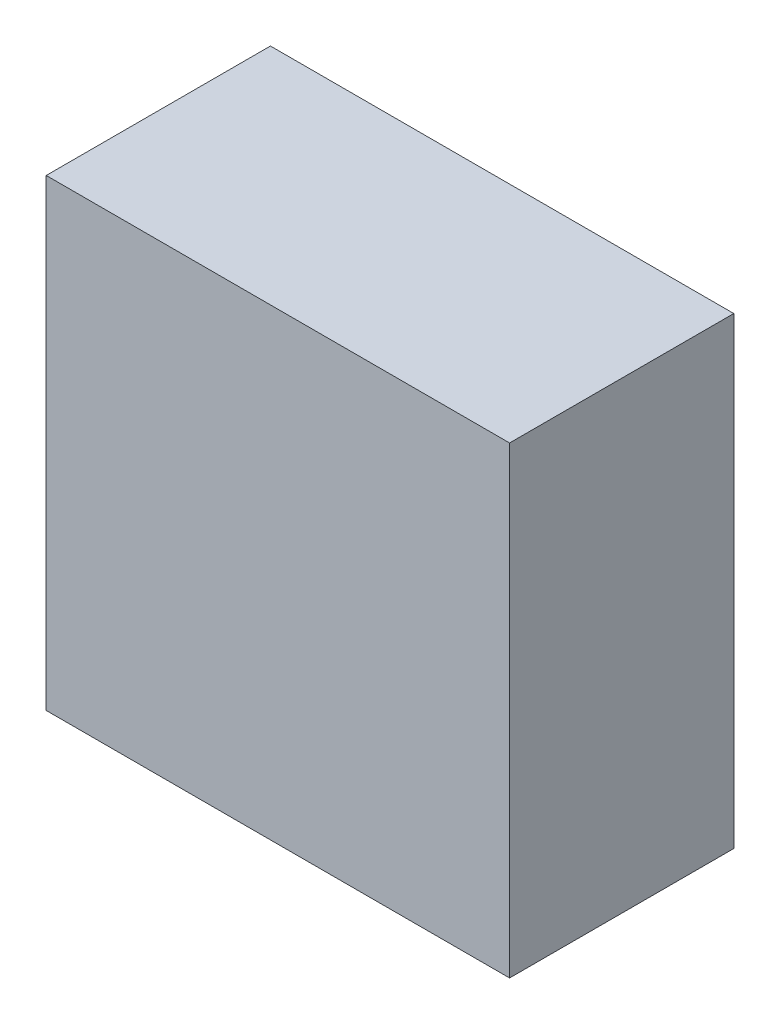
ISO-10303-21;
HEADER;
FILE_DESCRIPTION(('STEP AP214'),'2;1');
FILE_NAME('part.step','',(''),(''),'','','');
FILE_SCHEMA(('AUTOMOTIVE_DESIGN { 1 0 10303 214 1 1 1 1 }'));
ENDSEC;
DATA;
#1=APPLICATION_CONTEXT('core data for automotive mechanical design processes');
#2=APPLICATION_PROTOCOL_DEFINITION('international standard','automotive_design',2000,#1);
#3=PRODUCT_CONTEXT('',#1,'mechanical');
#4=PRODUCT('Part','Part','',(#3));
#5=PRODUCT_RELATED_PRODUCT_CATEGORY('part','',(#4));
#6=PRODUCT_DEFINITION_FORMATION('','',#4);
#7=PRODUCT_DEFINITION_CONTEXT('part definition',#1,'design');
#8=PRODUCT_DEFINITION('design','',#6,#7);
#9=PRODUCT_DEFINITION_SHAPE('','',#8);
#10=(LENGTH_UNIT() NAMED_UNIT(*) SI_UNIT(.MILLI.,.METRE.));
#11=(NAMED_UNIT(*) PLANE_ANGLE_UNIT() SI_UNIT($,.RADIAN.));
#12=(NAMED_UNIT(*) SI_UNIT($,.STERADIAN.) SOLID_ANGLE_UNIT());
#13=UNCERTAINTY_MEASURE_WITH_UNIT(LENGTH_MEASURE(1.E-05),#10,'distance_accuracy_value','');
#14=(GEOMETRIC_REPRESENTATION_CONTEXT(3) GLOBAL_UNCERTAINTY_ASSIGNED_CONTEXT((#13)) GLOBAL_UNIT_ASSIGNED_CONTEXT((#10,
#11,#12)) REPRESENTATION_CONTEXT('',''));
#15=CARTESIAN_POINT('',(0.,0.,0.));
#16=DIRECTION('',(0.,0.,1.));
#17=DIRECTION('',(1.,0.,0.));
#18=AXIS2_PLACEMENT_3D('',#15,#16,#17);
#19=CARTESIAN_POINT('',(-1.54999944,1.54999944,1.49999954));
#20=DIRECTION('',(0.,0.,-1.));
#21=DIRECTION('',(-1.,0.,0.));
#22=AXIS2_PLACEMENT_3D('',#19,#20,#21);
#23=PLANE('',#22);
#24=DIRECTION('',(1.,0.,0.));
#25=VECTOR('',#24,1.);
#26=CARTESIAN_POINT('',(-1.54999944,-1.54999944,1.49999954));
#27=LINE('',#26,#25);
#28=CARTESIAN_POINT('',(-1.54999944,-1.54999944,1.49999954));
#29=VERTEX_POINT('',#28);
#30=CARTESIAN_POINT('',(1.54999944,-1.54999944,1.49999954));
#31=VERTEX_POINT('',#30);
#32=EDGE_CURVE('E55',#29,#31,#27,.T.);
#33=ORIENTED_EDGE('',*,*,#32,.T.);
#34=DIRECTION('',(0.,1.,0.));
#35=VECTOR('',#34,1.);
#36=CARTESIAN_POINT('',(1.54999944,-1.54999944,1.49999954));
#37=LINE('',#36,#35);
#38=CARTESIAN_POINT('',(1.54999944,1.54999944,1.49999954));
#39=VERTEX_POINT('',#38);
#40=EDGE_CURVE('E57',#31,#39,#37,.T.);
#41=ORIENTED_EDGE('',*,*,#40,.T.);
#42=DIRECTION('',(1.,0.,0.));
#43=VECTOR('',#42,1.);
#44=CARTESIAN_POINT('',(1.54999944,1.54999944,1.49999954));
#45=LINE('',#44,#43);
#46=CARTESIAN_POINT('',(-1.54999944,1.54999944,1.49999954));
#47=VERTEX_POINT('',#46);
#48=EDGE_CURVE('E20',#39,#47,#45,.F.);
#49=ORIENTED_EDGE('',*,*,#48,.T.);
#50=DIRECTION('',(0.,1.,0.));
#51=VECTOR('',#50,1.);
#52=CARTESIAN_POINT('',(-1.54999944,1.54999944,1.49999954));
#53=LINE('',#52,#51);
#54=EDGE_CURVE('E80',#47,#29,#53,.F.);
#55=ORIENTED_EDGE('',*,*,#54,.T.);
#56=EDGE_LOOP('',(#33,#41,#49,#55));
#57=FACE_BOUND('',#56,.T.);
#58=ADVANCED_FACE('F17',(#57),#23,.F.);
#59=CARTESIAN_POINT('',(1.54999944,1.54999944,0.));
#60=DIRECTION('',(0.,-1.,0.));
#61=DIRECTION('',(0.,0.,-1.));
#62=AXIS2_PLACEMENT_3D('',#59,#60,#61);
#63=PLANE('',#62);
#64=DIRECTION('',(0.,0.,-1.));
#65=VECTOR('',#64,1.);
#66=CARTESIAN_POINT('',(-1.54999944,1.54999944,0.));
#67=LINE('',#66,#65);
#68=CARTESIAN_POINT('',(-1.54999944,1.54999944,0.));
#69=VERTEX_POINT('',#68);
#70=EDGE_CURVE('E68',#69,#47,#67,.F.);
#71=ORIENTED_EDGE('',*,*,#70,.T.);
#72=ORIENTED_EDGE('',*,*,#48,.F.);
#73=DIRECTION('',(0.,0.,1.));
#74=VECTOR('',#73,1.);
#75=CARTESIAN_POINT('',(1.54999944,1.54999944,0.));
#76=LINE('',#75,#74);
#77=CARTESIAN_POINT('',(1.54999944,1.54999944,0.));
#78=VERTEX_POINT('',#77);
#79=EDGE_CURVE('E63',#39,#78,#76,.F.);
#80=ORIENTED_EDGE('',*,*,#79,.T.);
#81=DIRECTION('',(-1.,0.,0.));
#82=VECTOR('',#81,1.);
#83=CARTESIAN_POINT('',(-1.54999944,1.54999944,0.));
#84=LINE('',#83,#82);
#85=EDGE_CURVE('E83',#69,#78,#84,.F.);
#86=ORIENTED_EDGE('',*,*,#85,.F.);
#87=EDGE_LOOP('',(#71,#72,#80,#86));
#88=FACE_BOUND('',#87,.T.);
#89=ADVANCED_FACE('F65',(#88),#63,.F.);
#90=CARTESIAN_POINT('',(1.54999944,-1.54999944,0.));
#91=DIRECTION('',(-1.,0.,0.));
#92=DIRECTION('',(0.,0.,1.));
#93=AXIS2_PLACEMENT_3D('',#90,#91,#92);
#94=PLANE('',#93);
#95=ORIENTED_EDGE('',*,*,#79,.F.);
#96=ORIENTED_EDGE('',*,*,#40,.F.);
#97=DIRECTION('',(0.,0.,1.));
#98=VECTOR('',#97,1.);
#99=CARTESIAN_POINT('',(1.54999944,-1.54999944,0.));
#100=LINE('',#99,#98);
#101=CARTESIAN_POINT('',(1.54999944,-1.54999944,0.));
#102=VERTEX_POINT('',#101);
#103=EDGE_CURVE('E75',#31,#102,#100,.F.);
#104=ORIENTED_EDGE('',*,*,#103,.T.);
#105=DIRECTION('',(0.,1.,0.));
#106=VECTOR('',#105,1.);
#107=CARTESIAN_POINT('',(1.54999944,1.54999944,0.));
#108=LINE('',#107,#106);
#109=EDGE_CURVE('E72',#78,#102,#108,.F.);
#110=ORIENTED_EDGE('',*,*,#109,.F.);
#111=EDGE_LOOP('',(#95,#96,#104,#110));
#112=FACE_BOUND('',#111,.T.);
#113=ADVANCED_FACE('F70',(#112),#94,.F.);
#114=CARTESIAN_POINT('',(-1.54999944,-1.54999944,0.));
#115=DIRECTION('',(0.,1.,0.));
#116=DIRECTION('',(0.,0.,1.));
#117=AXIS2_PLACEMENT_3D('',#114,#115,#116);
#118=PLANE('',#117);
#119=ORIENTED_EDGE('',*,*,#103,.F.);
#120=ORIENTED_EDGE('',*,*,#32,.F.);
#121=DIRECTION('',(0.,0.,-1.));
#122=VECTOR('',#121,1.);
#123=CARTESIAN_POINT('',(-1.54999944,-1.54999944,0.));
#124=LINE('',#123,#122);
#125=CARTESIAN_POINT('',(-1.54999944,-1.54999944,0.));
#126=VERTEX_POINT('',#125);
#127=EDGE_CURVE('E35',#29,#126,#124,.T.);
#128=ORIENTED_EDGE('',*,*,#127,.T.);
#129=DIRECTION('',(-1.,0.,0.));
#130=VECTOR('',#129,1.);
#131=CARTESIAN_POINT('',(-1.54999944,-1.54999944,0.));
#132=LINE('',#131,#130);
#133=EDGE_CURVE('E26',#102,#126,#132,.T.);
#134=ORIENTED_EDGE('',*,*,#133,.F.);
#135=EDGE_LOOP('',(#119,#120,#128,#134));
#136=FACE_BOUND('',#135,.T.);
#137=ADVANCED_FACE('F89',(#136),#118,.F.);
#138=CARTESIAN_POINT('',(-1.54999944,1.54999944,0.));
#139=DIRECTION('',(1.,0.,0.));
#140=DIRECTION('',(0.,0.,-1.));
#141=AXIS2_PLACEMENT_3D('',#138,#139,#140);
#142=PLANE('',#141);
#143=ORIENTED_EDGE('',*,*,#127,.F.);
#144=ORIENTED_EDGE('',*,*,#54,.F.);
#145=ORIENTED_EDGE('',*,*,#70,.F.);
#146=DIRECTION('',(0.,1.,0.));
#147=VECTOR('',#146,1.);
#148=CARTESIAN_POINT('',(-1.54999944,1.54999944,0.));
#149=LINE('',#148,#147);
#150=EDGE_CURVE('E11',#126,#69,#149,.T.);
#151=ORIENTED_EDGE('',*,*,#150,.F.);
#152=EDGE_LOOP('',(#143,#144,#145,#151));
#153=FACE_BOUND('',#152,.T.);
#154=ADVANCED_FACE('F91',(#153),#142,.F.);
#155=CARTESIAN_POINT('',(-1.54999944,1.54999944,0.));
#156=DIRECTION('',(0.,0.,-1.));
#157=DIRECTION('',(-1.,0.,0.));
#158=AXIS2_PLACEMENT_3D('',#155,#156,#157);
#159=PLANE('',#158);
#160=ORIENTED_EDGE('',*,*,#133,.T.);
#161=ORIENTED_EDGE('',*,*,#150,.T.);
#162=ORIENTED_EDGE('',*,*,#85,.T.);
#163=ORIENTED_EDGE('',*,*,#109,.T.);
#164=EDGE_LOOP('',(#160,#161,#162,#163));
#165=FACE_BOUND('',#164,.T.);
#166=ADVANCED_FACE('F88',(#165),#159,.T.);
#167=CLOSED_SHELL('',(#58,#89,#113,#137,#154,#166));
#168=MANIFOLD_SOLID_BREP('B1',#167);
#169=ADVANCED_BREP_SHAPE_REPRESENTATION('',(#18,#168),#14);
#170=SHAPE_DEFINITION_REPRESENTATION(#9,#169);
ENDSEC;
END-ISO-10303-21;
